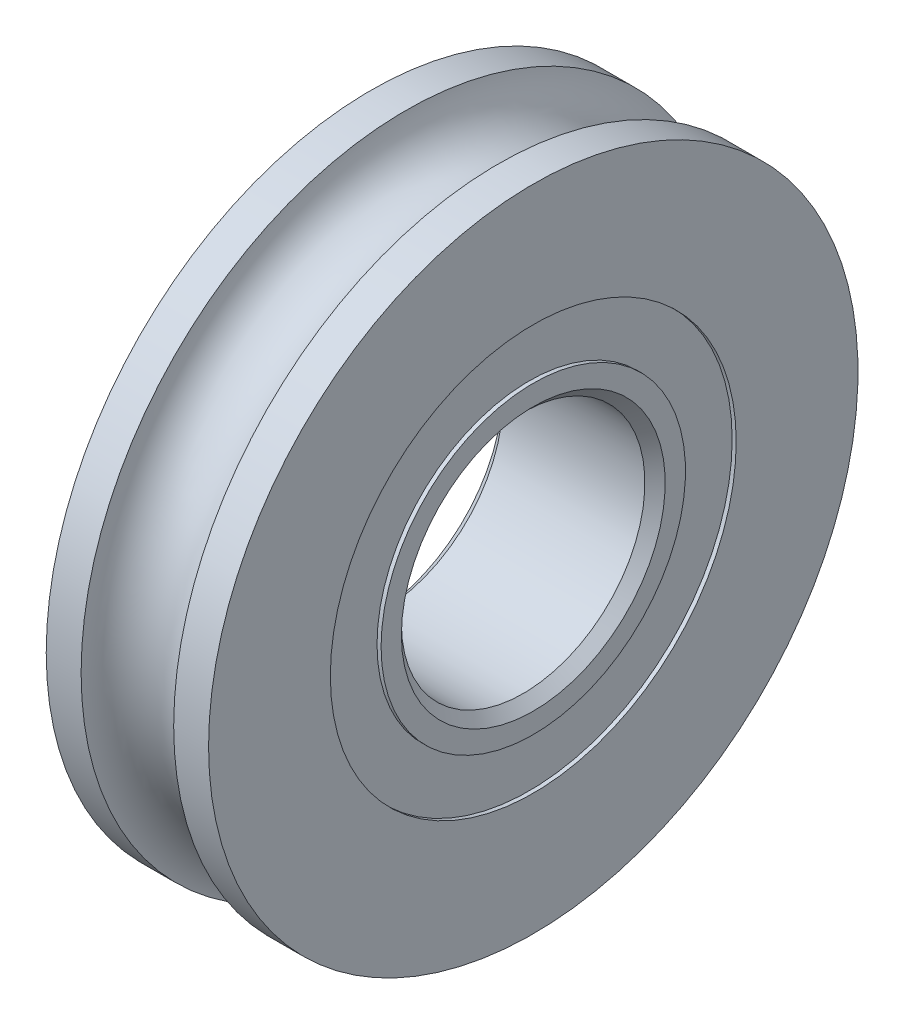
ISO-10303-21;
HEADER;
FILE_DESCRIPTION(('STEP AP214'),'2;1');
FILE_NAME('part.step','',(''),(''),'','','');
FILE_SCHEMA(('AUTOMOTIVE_DESIGN { 1 0 10303 214 1 1 1 1 }'));
ENDSEC;
DATA;
#1=APPLICATION_CONTEXT('core data for automotive mechanical design processes');
#2=APPLICATION_PROTOCOL_DEFINITION('international standard','automotive_design',2000,#1);
#3=PRODUCT_CONTEXT('',#1,'mechanical');
#4=PRODUCT('Part','Part','',(#3));
#5=PRODUCT_RELATED_PRODUCT_CATEGORY('part','',(#4));
#6=PRODUCT_DEFINITION_FORMATION('','',#4);
#7=PRODUCT_DEFINITION_CONTEXT('part definition',#1,'design');
#8=PRODUCT_DEFINITION('design','',#6,#7);
#9=PRODUCT_DEFINITION_SHAPE('','',#8);
#10=(LENGTH_UNIT() NAMED_UNIT(*) SI_UNIT(.MILLI.,.METRE.));
#11=(NAMED_UNIT(*) PLANE_ANGLE_UNIT() SI_UNIT($,.RADIAN.));
#12=(NAMED_UNIT(*) SI_UNIT($,.STERADIAN.) SOLID_ANGLE_UNIT());
#13=UNCERTAINTY_MEASURE_WITH_UNIT(LENGTH_MEASURE(1.E-05),#10,'distance_accuracy_value','');
#14=(GEOMETRIC_REPRESENTATION_CONTEXT(3) GLOBAL_UNCERTAINTY_ASSIGNED_CONTEXT((#13)) GLOBAL_UNIT_ASSIGNED_CONTEXT((#10,
#11,#12)) REPRESENTATION_CONTEXT('',''));
#15=CARTESIAN_POINT('',(0.,0.,0.));
#16=DIRECTION('',(0.,0.,1.));
#17=DIRECTION('',(1.,0.,0.));
#18=AXIS2_PLACEMENT_3D('',#15,#16,#17);
#19=CARTESIAN_POINT('',(-2.,3.75,0.));
#20=DIRECTION('',(1.,0.,0.));
#21=DIRECTION('',(0.,0.,-1.));
#22=AXIS2_PLACEMENT_3D('',#19,#20,#21);
#23=PLANE('',#22);
#24=CARTESIAN_POINT('',(-2.,0.,0.));
#25=DIRECTION('',(-1.,0.,0.));
#26=DIRECTION('',(0.,0.,1.));
#27=AXIS2_PLACEMENT_3D('',#24,#25,#26);
#28=CIRCLE('',#27,3.25);
#29=CARTESIAN_POINT('',(-2.,0.,3.25));
#30=VERTEX_POINT('',#29);
#31=EDGE_CURVE('E67',#30,#30,#28,.T.);
#32=ORIENTED_EDGE('',*,*,#31,.F.);
#33=EDGE_LOOP('',(#32));
#34=FACE_BOUND('',#33,.T.);
#35=CARTESIAN_POINT('',(-2.,0.,0.));
#36=DIRECTION('',(-1.,0.,0.));
#37=DIRECTION('',(0.,0.,1.));
#38=AXIS2_PLACEMENT_3D('',#35,#36,#37);
#39=CIRCLE('',#38,3.75);
#40=CARTESIAN_POINT('',(-2.,0.,3.75));
#41=VERTEX_POINT('',#40);
#42=EDGE_CURVE('E10',#41,#41,#39,.T.);
#43=ORIENTED_EDGE('',*,*,#42,.T.);
#44=EDGE_LOOP('',(#43));
#45=FACE_BOUND('',#44,.T.);
#46=ADVANCED_FACE('F15',(#34,#45),#23,.F.);
#47=CARTESIAN_POINT('',(2.,0.,0.));
#48=DIRECTION('',(-1.,0.,0.));
#49=DIRECTION('',(0.,0.,1.));
#50=AXIS2_PLACEMENT_3D('',#47,#48,#49);
#51=CYLINDRICAL_SURFACE('',#50,3.75);
#52=ORIENTED_EDGE('',*,*,#42,.F.);
#53=EDGE_LOOP('',(#52));
#54=FACE_BOUND('',#53,.T.);
#55=CARTESIAN_POINT('',(-1.9,0.,0.));
#56=DIRECTION('',(-1.,0.,0.));
#57=DIRECTION('',(0.,0.,1.));
#58=AXIS2_PLACEMENT_3D('',#55,#56,#57);
#59=CIRCLE('',#58,3.75);
#60=CARTESIAN_POINT('',(-1.9,0.,3.75));
#61=VERTEX_POINT('',#60);
#62=EDGE_CURVE('E21',#61,#61,#59,.T.);
#63=ORIENTED_EDGE('',*,*,#62,.T.);
#64=EDGE_LOOP('',(#63));
#65=FACE_BOUND('',#64,.T.);
#66=ADVANCED_FACE('F74',(#54,#65),#51,.T.);
#67=CARTESIAN_POINT('',(-1.9,5.,0.));
#68=DIRECTION('',(1.,0.,0.));
#69=DIRECTION('',(0.,0.,-1.));
#70=AXIS2_PLACEMENT_3D('',#67,#68,#69);
#71=PLANE('',#70);
#72=ORIENTED_EDGE('',*,*,#62,.F.);
#73=EDGE_LOOP('',(#72));
#74=FACE_BOUND('',#73,.T.);
#75=CARTESIAN_POINT('',(-1.9,0.,0.));
#76=DIRECTION('',(-1.,0.,0.));
#77=DIRECTION('',(0.,0.,1.));
#78=AXIS2_PLACEMENT_3D('',#75,#76,#77);
#79=CIRCLE('',#78,5.);
#80=CARTESIAN_POINT('',(-1.9,0.,5.));
#81=VERTEX_POINT('',#80);
#82=EDGE_CURVE('E25',#81,#81,#79,.T.);
#83=ORIENTED_EDGE('',*,*,#82,.T.);
#84=EDGE_LOOP('',(#83));
#85=FACE_BOUND('',#84,.T.);
#86=ADVANCED_FACE('F80',(#74,#85),#71,.F.);
#87=CARTESIAN_POINT('',(2.,0.,0.));
#88=DIRECTION('',(-1.,0.,0.));
#89=DIRECTION('',(0.,0.,1.));
#90=AXIS2_PLACEMENT_3D('',#87,#88,#89);
#91=CYLINDRICAL_SURFACE('',#90,5.);
#92=ORIENTED_EDGE('',*,*,#82,.F.);
#93=EDGE_LOOP('',(#92));
#94=FACE_BOUND('',#93,.T.);
#95=CARTESIAN_POINT('',(-2.,0.,0.));
#96=DIRECTION('',(-1.,0.,0.));
#97=DIRECTION('',(0.,0.,1.));
#98=AXIS2_PLACEMENT_3D('',#95,#96,#97);
#99=CIRCLE('',#98,5.);
#100=CARTESIAN_POINT('',(-2.,0.,5.));
#101=VERTEX_POINT('',#100);
#102=EDGE_CURVE('E29',#101,#101,#99,.T.);
#103=ORIENTED_EDGE('',*,*,#102,.T.);
#104=EDGE_LOOP('',(#103));
#105=FACE_BOUND('',#104,.T.);
#106=ADVANCED_FACE('F86',(#94,#105),#91,.F.);
#107=CARTESIAN_POINT('',(-2.,8.,0.));
#108=DIRECTION('',(1.,0.,0.));
#109=DIRECTION('',(0.,0.,-1.));
#110=AXIS2_PLACEMENT_3D('',#107,#108,#109);
#111=PLANE('',#110);
#112=ORIENTED_EDGE('',*,*,#102,.F.);
#113=EDGE_LOOP('',(#112));
#114=FACE_BOUND('',#113,.T.);
#115=CARTESIAN_POINT('',(-2.,0.,0.));
#116=DIRECTION('',(-1.,0.,0.));
#117=DIRECTION('',(0.,0.,1.));
#118=AXIS2_PLACEMENT_3D('',#115,#116,#117);
#119=CIRCLE('',#118,8.);
#120=CARTESIAN_POINT('',(-2.,0.,8.));
#121=VERTEX_POINT('',#120);
#122=EDGE_CURVE('E34',#121,#121,#119,.T.);
#123=ORIENTED_EDGE('',*,*,#122,.T.);
#124=EDGE_LOOP('',(#123));
#125=FACE_BOUND('',#124,.T.);
#126=ADVANCED_FACE('F92',(#114,#125),#111,.F.);
#127=CARTESIAN_POINT('',(2.,0.,0.));
#128=DIRECTION('',(-1.,0.,0.));
#129=DIRECTION('',(0.,0.,1.));
#130=AXIS2_PLACEMENT_3D('',#127,#128,#129);
#131=CYLINDRICAL_SURFACE('',#130,8.);
#132=ORIENTED_EDGE('',*,*,#122,.F.);
#133=EDGE_LOOP('',(#132));
#134=FACE_BOUND('',#133,.T.);
#135=CARTESIAN_POINT('',(-1.1401754250991,0.,0.));
#136=DIRECTION('',(-1.,0.,0.));
#137=DIRECTION('',(0.,0.,1.));
#138=AXIS2_PLACEMENT_3D('',#135,#136,#137);
#139=CIRCLE('',#138,8.);
#140=CARTESIAN_POINT('',(-1.1401754250991,0.,8.));
#141=VERTEX_POINT('',#140);
#142=EDGE_CURVE('E37',#141,#141,#139,.T.);
#143=ORIENTED_EDGE('',*,*,#142,.T.);
#144=EDGE_LOOP('',(#143));
#145=FACE_BOUND('',#144,.T.);
#146=ADVANCED_FACE('F96',(#134,#145),#131,.T.);
#147=CARTESIAN_POINT('',(0.,0.,0.));
#148=DIRECTION('',(-1.,0.,0.));
#149=DIRECTION('',(0.,0.,1.));
#150=AXIS2_PLACEMENT_3D('',#147,#148,#149);
#151=TOROIDAL_SURFACE('',#150,8.15,1.14999999999996);
#152=ORIENTED_EDGE('',*,*,#142,.F.);
#153=EDGE_LOOP('',(#152));
#154=FACE_BOUND('',#153,.T.);
#155=CARTESIAN_POINT('',(1.1401754250991,0.,0.));
#156=DIRECTION('',(-1.,0.,0.));
#157=DIRECTION('',(0.,0.,1.));
#158=AXIS2_PLACEMENT_3D('',#155,#156,#157);
#159=CIRCLE('',#158,8.);
#160=CARTESIAN_POINT('',(1.1401754250991,0.,8.));
#161=VERTEX_POINT('',#160);
#162=EDGE_CURVE('E40',#161,#161,#159,.T.);
#163=ORIENTED_EDGE('',*,*,#162,.T.);
#164=EDGE_LOOP('',(#163));
#165=FACE_BOUND('',#164,.T.);
#166=ADVANCED_FACE('F100',(#154,#165),#151,.F.);
#167=CARTESIAN_POINT('',(2.,0.,0.));
#168=DIRECTION('',(-1.,0.,0.));
#169=DIRECTION('',(0.,0.,1.));
#170=AXIS2_PLACEMENT_3D('',#167,#168,#169);
#171=CYLINDRICAL_SURFACE('',#170,8.);
#172=ORIENTED_EDGE('',*,*,#162,.F.);
#173=EDGE_LOOP('',(#172));
#174=FACE_BOUND('',#173,.T.);
#175=CARTESIAN_POINT('',(2.,0.,0.));
#176=DIRECTION('',(-1.,0.,0.));
#177=DIRECTION('',(0.,0.,1.));
#178=AXIS2_PLACEMENT_3D('',#175,#176,#177);
#179=CIRCLE('',#178,8.);
#180=CARTESIAN_POINT('',(2.,0.,8.));
#181=VERTEX_POINT('',#180);
#182=EDGE_CURVE('E43',#181,#181,#179,.T.);
#183=ORIENTED_EDGE('',*,*,#182,.T.);
#184=EDGE_LOOP('',(#183));
#185=FACE_BOUND('',#184,.T.);
#186=ADVANCED_FACE('F104',(#174,#185),#171,.T.);
#187=CARTESIAN_POINT('',(2.,5.,0.));
#188=DIRECTION('',(-1.,0.,0.));
#189=DIRECTION('',(0.,0.,1.));
#190=AXIS2_PLACEMENT_3D('',#187,#188,#189);
#191=PLANE('',#190);
#192=ORIENTED_EDGE('',*,*,#182,.F.);
#193=EDGE_LOOP('',(#192));
#194=FACE_BOUND('',#193,.T.);
#195=CARTESIAN_POINT('',(2.,0.,0.));
#196=DIRECTION('',(-1.,0.,0.));
#197=DIRECTION('',(0.,0.,1.));
#198=AXIS2_PLACEMENT_3D('',#195,#196,#197);
#199=CIRCLE('',#198,5.);
#200=CARTESIAN_POINT('',(2.,0.,5.));
#201=VERTEX_POINT('',#200);
#202=EDGE_CURVE('E46',#201,#201,#199,.T.);
#203=ORIENTED_EDGE('',*,*,#202,.T.);
#204=EDGE_LOOP('',(#203));
#205=FACE_BOUND('',#204,.T.);
#206=ADVANCED_FACE('F108',(#194,#205),#191,.F.);
#207=CARTESIAN_POINT('',(2.,0.,0.));
#208=DIRECTION('',(-1.,0.,0.));
#209=DIRECTION('',(0.,0.,1.));
#210=AXIS2_PLACEMENT_3D('',#207,#208,#209);
#211=CYLINDRICAL_SURFACE('',#210,5.);
#212=ORIENTED_EDGE('',*,*,#202,.F.);
#213=EDGE_LOOP('',(#212));
#214=FACE_BOUND('',#213,.T.);
#215=CARTESIAN_POINT('',(1.9,0.,0.));
#216=DIRECTION('',(-1.,0.,0.));
#217=DIRECTION('',(0.,0.,1.));
#218=AXIS2_PLACEMENT_3D('',#215,#216,#217);
#219=CIRCLE('',#218,5.);
#220=CARTESIAN_POINT('',(1.9,0.,5.));
#221=VERTEX_POINT('',#220);
#222=EDGE_CURVE('E49',#221,#221,#219,.T.);
#223=ORIENTED_EDGE('',*,*,#222,.T.);
#224=EDGE_LOOP('',(#223));
#225=FACE_BOUND('',#224,.T.);
#226=ADVANCED_FACE('F112',(#214,#225),#211,.F.);
#227=CARTESIAN_POINT('',(1.9,3.75,0.));
#228=DIRECTION('',(-1.,0.,0.));
#229=DIRECTION('',(0.,0.,1.));
#230=AXIS2_PLACEMENT_3D('',#227,#228,#229);
#231=PLANE('',#230);
#232=ORIENTED_EDGE('',*,*,#222,.F.);
#233=EDGE_LOOP('',(#232));
#234=FACE_BOUND('',#233,.T.);
#235=CARTESIAN_POINT('',(1.9,0.,0.));
#236=DIRECTION('',(-1.,0.,0.));
#237=DIRECTION('',(0.,0.,1.));
#238=AXIS2_PLACEMENT_3D('',#235,#236,#237);
#239=CIRCLE('',#238,3.75);
#240=CARTESIAN_POINT('',(1.9,0.,3.75));
#241=VERTEX_POINT('',#240);
#242=EDGE_CURVE('E52',#241,#241,#239,.T.);
#243=ORIENTED_EDGE('',*,*,#242,.T.);
#244=EDGE_LOOP('',(#243));
#245=FACE_BOUND('',#244,.T.);
#246=ADVANCED_FACE('F116',(#234,#245),#231,.F.);
#247=CARTESIAN_POINT('',(2.,0.,0.));
#248=DIRECTION('',(-1.,0.,0.));
#249=DIRECTION('',(0.,0.,1.));
#250=AXIS2_PLACEMENT_3D('',#247,#248,#249);
#251=CYLINDRICAL_SURFACE('',#250,3.75);
#252=ORIENTED_EDGE('',*,*,#242,.F.);
#253=EDGE_LOOP('',(#252));
#254=FACE_BOUND('',#253,.T.);
#255=CARTESIAN_POINT('',(2.,0.,0.));
#256=DIRECTION('',(-1.,0.,0.));
#257=DIRECTION('',(0.,0.,1.));
#258=AXIS2_PLACEMENT_3D('',#255,#256,#257);
#259=CIRCLE('',#258,3.75);
#260=CARTESIAN_POINT('',(2.,0.,3.75));
#261=VERTEX_POINT('',#260);
#262=EDGE_CURVE('E55',#261,#261,#259,.T.);
#263=ORIENTED_EDGE('',*,*,#262,.T.);
#264=EDGE_LOOP('',(#263));
#265=FACE_BOUND('',#264,.T.);
#266=ADVANCED_FACE('F120',(#254,#265),#251,.T.);
#267=CARTESIAN_POINT('',(2.,3.25,0.));
#268=DIRECTION('',(-1.,0.,0.));
#269=DIRECTION('',(0.,0.,1.));
#270=AXIS2_PLACEMENT_3D('',#267,#268,#269);
#271=PLANE('',#270);
#272=ORIENTED_EDGE('',*,*,#262,.F.);
#273=EDGE_LOOP('',(#272));
#274=FACE_BOUND('',#273,.T.);
#275=CARTESIAN_POINT('',(2.,0.,0.));
#276=DIRECTION('',(-1.,0.,0.));
#277=DIRECTION('',(0.,0.,1.));
#278=AXIS2_PLACEMENT_3D('',#275,#276,#277);
#279=CIRCLE('',#278,3.25);
#280=CARTESIAN_POINT('',(2.,0.,3.25));
#281=VERTEX_POINT('',#280);
#282=EDGE_CURVE('E58',#281,#281,#279,.T.);
#283=ORIENTED_EDGE('',*,*,#282,.T.);
#284=EDGE_LOOP('',(#283));
#285=FACE_BOUND('',#284,.T.);
#286=ADVANCED_FACE('F124',(#274,#285),#271,.F.);
#287=CARTESIAN_POINT('',(1.75,0.,0.));
#288=DIRECTION('',(1.,0.,0.));
#289=DIRECTION('',(0.,0.,-1.));
#290=AXIS2_PLACEMENT_3D('',#287,#288,#289);
#291=CONICAL_SURFACE('',#290,3.,0.785398163397448);
#292=ORIENTED_EDGE('',*,*,#282,.F.);
#293=EDGE_LOOP('',(#292));
#294=FACE_BOUND('',#293,.T.);
#295=CARTESIAN_POINT('',(1.75,0.,0.));
#296=DIRECTION('',(-1.,0.,0.));
#297=DIRECTION('',(0.,0.,1.));
#298=AXIS2_PLACEMENT_3D('',#295,#296,#297);
#299=CIRCLE('',#298,3.);
#300=CARTESIAN_POINT('',(1.75,0.,3.));
#301=VERTEX_POINT('',#300);
#302=EDGE_CURVE('E61',#301,#301,#299,.T.);
#303=ORIENTED_EDGE('',*,*,#302,.T.);
#304=EDGE_LOOP('',(#303));
#305=FACE_BOUND('',#304,.T.);
#306=ADVANCED_FACE('F128',(#294,#305),#291,.F.);
#307=CARTESIAN_POINT('',(2.,0.,0.));
#308=DIRECTION('',(-1.,0.,0.));
#309=DIRECTION('',(0.,0.,1.));
#310=AXIS2_PLACEMENT_3D('',#307,#308,#309);
#311=CYLINDRICAL_SURFACE('',#310,3.);
#312=ORIENTED_EDGE('',*,*,#302,.F.);
#313=EDGE_LOOP('',(#312));
#314=FACE_BOUND('',#313,.T.);
#315=CARTESIAN_POINT('',(-1.75,0.,0.));
#316=DIRECTION('',(-1.,0.,0.));
#317=DIRECTION('',(0.,0.,1.));
#318=AXIS2_PLACEMENT_3D('',#315,#316,#317);
#319=CIRCLE('',#318,3.);
#320=CARTESIAN_POINT('',(-1.75,0.,3.));
#321=VERTEX_POINT('',#320);
#322=EDGE_CURVE('E64',#321,#321,#319,.T.);
#323=ORIENTED_EDGE('',*,*,#322,.T.);
#324=EDGE_LOOP('',(#323));
#325=FACE_BOUND('',#324,.T.);
#326=ADVANCED_FACE('F132',(#314,#325),#311,.F.);
#327=CARTESIAN_POINT('',(-2.,0.,0.));
#328=DIRECTION('',(-1.,0.,0.));
#329=DIRECTION('',(0.,0.,1.));
#330=AXIS2_PLACEMENT_3D('',#327,#328,#329);
#331=CONICAL_SURFACE('',#330,3.25,0.785398163397448);
#332=ORIENTED_EDGE('',*,*,#322,.F.);
#333=EDGE_LOOP('',(#332));
#334=FACE_BOUND('',#333,.T.);
#335=ORIENTED_EDGE('',*,*,#31,.T.);
#336=EDGE_LOOP('',(#335));
#337=FACE_BOUND('',#336,.T.);
#338=ADVANCED_FACE('F71',(#334,#337),#331,.F.);
#339=CLOSED_SHELL('',(#46,#66,#86,#106,#126,#146,#166,#186,#206,#226,#246,#266,#286,#306,#326,#338));
#340=MANIFOLD_SOLID_BREP('B1',#339);
#341=ADVANCED_BREP_SHAPE_REPRESENTATION('',(#18,#340),#14);
#342=SHAPE_DEFINITION_REPRESENTATION(#9,#341);
ENDSEC;
END-ISO-10303-21;
